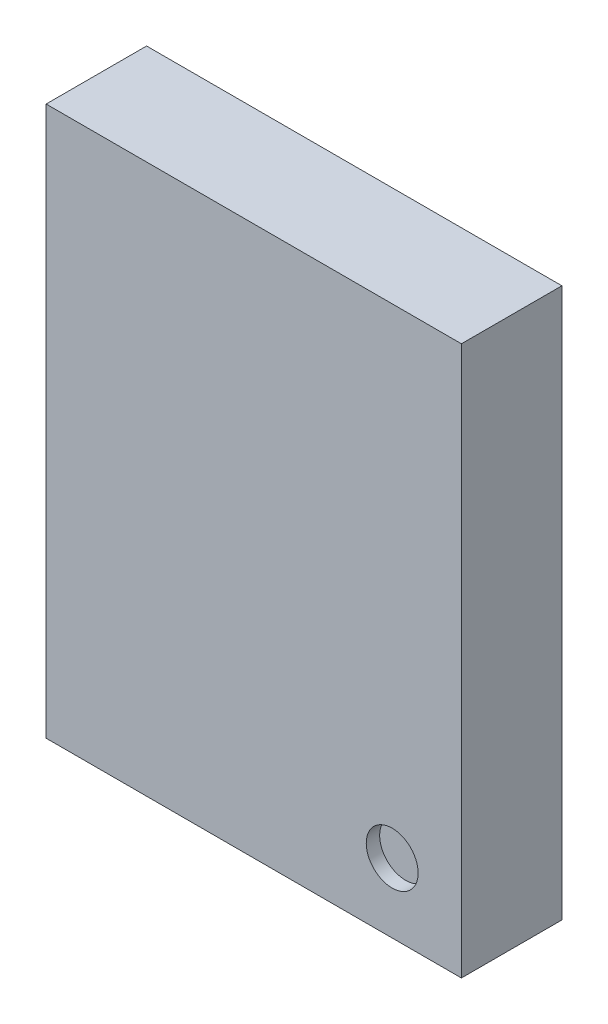
ISO-10303-21;
HEADER;
FILE_DESCRIPTION(('STEP AP214'),'2;1');
FILE_NAME('part.step','',(''),(''),'','','');
FILE_SCHEMA(('AUTOMOTIVE_DESIGN { 1 0 10303 214 1 1 1 1 }'));
ENDSEC;
DATA;
#1=APPLICATION_CONTEXT('core data for automotive mechanical design processes');
#2=APPLICATION_PROTOCOL_DEFINITION('international standard','automotive_design',2000,#1);
#3=PRODUCT_CONTEXT('',#1,'mechanical');
#4=PRODUCT('Part','Part','',(#3));
#5=PRODUCT_RELATED_PRODUCT_CATEGORY('part','',(#4));
#6=PRODUCT_DEFINITION_FORMATION('','',#4);
#7=PRODUCT_DEFINITION_CONTEXT('part definition',#1,'design');
#8=PRODUCT_DEFINITION('design','',#6,#7);
#9=PRODUCT_DEFINITION_SHAPE('','',#8);
#10=(LENGTH_UNIT() NAMED_UNIT(*) SI_UNIT(.MILLI.,.METRE.));
#11=(NAMED_UNIT(*) PLANE_ANGLE_UNIT() SI_UNIT($,.RADIAN.));
#12=(NAMED_UNIT(*) SI_UNIT($,.STERADIAN.) SOLID_ANGLE_UNIT());
#13=UNCERTAINTY_MEASURE_WITH_UNIT(LENGTH_MEASURE(1.E-05),#10,'distance_accuracy_value','');
#14=(GEOMETRIC_REPRESENTATION_CONTEXT(3) GLOBAL_UNCERTAINTY_ASSIGNED_CONTEXT((#13)) GLOBAL_UNIT_ASSIGNED_CONTEXT((#10,
#11,#12)) REPRESENTATION_CONTEXT('',''));
#15=CARTESIAN_POINT('',(0.,0.,0.));
#16=DIRECTION('',(0.,0.,1.));
#17=DIRECTION('',(1.,0.,0.));
#18=AXIS2_PLACEMENT_3D('',#15,#16,#17);
#19=CARTESIAN_POINT('',(44.211633119803,23.873785966457,0.75));
#20=DIRECTION('',(0.,0.,1.));
#21=DIRECTION('',(1.,0.,0.));
#22=AXIS2_PLACEMENT_3D('',#19,#20,#21);
#23=PLANE('',#22);
#24=CARTESIAN_POINT('',(44.211633119803,23.873785966457,0.75));
#25=DIRECTION('',(0.,0.,1.));
#26=DIRECTION('',(-1.,-8.74227765734797E-08,0.));
#27=AXIS2_PLACEMENT_3D('',#24,#25,#26);
#28=CIRCLE('',#27,0.19375);
#29=CARTESIAN_POINT('',(44.017883119803,23.873785949519,0.75));
#30=VERTEX_POINT('',#29);
#31=EDGE_CURVE('E26',#30,#30,#28,.T.);
#32=ORIENTED_EDGE('',*,*,#31,.T.);
#33=EDGE_LOOP('',(#32));
#34=FACE_BOUND('',#33,.T.);
#35=ADVANCED_FACE('F16',(#34),#23,.T.);
#36=CARTESIAN_POINT('',(44.211633119803,23.873785966457,0.75));
#37=DIRECTION('',(0.,0.,1.));
#38=DIRECTION('',(-1.,-8.74227765734797E-08,0.));
#39=AXIS2_PLACEMENT_3D('',#36,#37,#38);
#40=CYLINDRICAL_SURFACE('',#39,0.19375);
#41=ORIENTED_EDGE('',*,*,#31,.F.);
#42=DIRECTION('',(0.,0.,1.));
#43=VECTOR('',#42,1.);
#44=CARTESIAN_POINT('',(44.017883119803,23.873785949519,0.75));
#45=LINE('',#44,#43);
#46=CARTESIAN_POINT('',(44.017883119803,23.873785949519,0.85));
#47=VERTEX_POINT('',#46);
#48=EDGE_CURVE('E11',#30,#47,#45,.T.);
#49=ORIENTED_EDGE('',*,*,#48,.T.);
#50=CARTESIAN_POINT('',(44.211633119803,23.873785966457,0.85));
#51=DIRECTION('',(0.,0.,1.));
#52=DIRECTION('',(-1.,-8.74227765734797E-08,0.));
#53=AXIS2_PLACEMENT_3D('',#50,#51,#52);
#54=CIRCLE('',#53,0.19375);
#55=EDGE_CURVE('E83',#47,#47,#54,.T.);
#56=ORIENTED_EDGE('',*,*,#55,.T.);
#57=ORIENTED_EDGE('',*,*,#48,.F.);
#58=EDGE_LOOP('',(#41,#49,#56,#57));
#59=FACE_BOUND('',#58,.T.);
#60=ADVANCED_FACE('F159',(#59),#40,.F.);
#61=CARTESIAN_POINT('',(41.628299473205,27.457119073948,0.1));
#62=DIRECTION('',(-1.,-8.74227765734797E-08,0.));
#63=DIRECTION('',(-8.74227765734797E-08,1.,0.));
#64=AXIS2_PLACEMENT_3D('',#61,#62,#63);
#65=PLANE('',#64);
#66=DIRECTION('',(0.,0.,1.));
#67=VECTOR('',#66,1.);
#68=CARTESIAN_POINT('',(41.628299473205,27.457119073948,0.1));
#69=LINE('',#68,#67);
#70=CARTESIAN_POINT('',(41.628299473205,27.457119073948,0.1));
#71=VERTEX_POINT('',#70);
#72=CARTESIAN_POINT('',(41.628299473205,27.457119073948,0.85));
#73=VERTEX_POINT('',#72);
#74=EDGE_CURVE('E115',#71,#73,#69,.T.);
#75=ORIENTED_EDGE('',*,*,#74,.F.);
#76=DIRECTION('',(8.74227765734797E-08,-1.,0.));
#77=VECTOR('',#76,1.);
#78=CARTESIAN_POINT('',(41.628299473205,27.457119073948,0.1));
#79=LINE('',#78,#77);
#80=CARTESIAN_POINT('',(41.628299831639,23.357119073948,0.1));
#81=VERTEX_POINT('',#80);
#82=EDGE_CURVE('E112',#71,#81,#79,.T.);
#83=ORIENTED_EDGE('',*,*,#82,.T.);
#84=DIRECTION('',(0.,0.,1.));
#85=VECTOR('',#84,1.);
#86=CARTESIAN_POINT('',(41.628299831639,23.357119073948,0.1));
#87=LINE('',#86,#85);
#88=CARTESIAN_POINT('',(41.628299831639,23.357119073948,0.85));
#89=VERTEX_POINT('',#88);
#90=EDGE_CURVE('E79',#81,#89,#87,.T.);
#91=ORIENTED_EDGE('',*,*,#90,.T.);
#92=DIRECTION('',(8.74227765734797E-08,-1.,0.));
#93=VECTOR('',#92,1.);
#94=CARTESIAN_POINT('',(41.628299473205,27.457119073948,0.85));
#95=LINE('',#94,#93);
#96=EDGE_CURVE('E109',#73,#89,#95,.T.);
#97=ORIENTED_EDGE('',*,*,#96,.F.);
#98=EDGE_LOOP('',(#75,#83,#91,#97));
#99=FACE_BOUND('',#98,.T.);
#100=ADVANCED_FACE('F147',(#99),#65,.T.);
#101=CARTESIAN_POINT('',(44.728299473205,27.457119344958,0.1));
#102=DIRECTION('',(0.,0.,1.));
#103=DIRECTION('',(1.,0.,0.));
#104=AXIS2_PLACEMENT_3D('',#101,#102,#103);
#105=PLANE('',#104);
#106=DIRECTION('',(-1.,-8.74227765734797E-08,0.));
#107=VECTOR('',#106,1.);
#108=CARTESIAN_POINT('',(44.728299831639,23.357119344958,0.1));
#109=LINE('',#108,#107);
#110=CARTESIAN_POINT('',(44.728299831639,23.357119344958,0.1));
#111=VERTEX_POINT('',#110);
#112=EDGE_CURVE('E19',#111,#81,#109,.T.);
#113=ORIENTED_EDGE('',*,*,#112,.T.);
#114=ORIENTED_EDGE('',*,*,#82,.F.);
#115=DIRECTION('',(-1.,-8.74227765734797E-08,0.));
#116=VECTOR('',#115,1.);
#117=CARTESIAN_POINT('',(44.728299473205,27.457119344958,0.1));
#118=LINE('',#117,#116);
#119=CARTESIAN_POINT('',(44.728299473205,27.457119344958,0.1));
#120=VERTEX_POINT('',#119);
#121=EDGE_CURVE('E88',#120,#71,#118,.T.);
#122=ORIENTED_EDGE('',*,*,#121,.F.);
#123=DIRECTION('',(8.74227765734797E-08,-1.,0.));
#124=VECTOR('',#123,1.);
#125=CARTESIAN_POINT('',(44.728299473205,27.457119344958,0.1));
#126=LINE('',#125,#124);
#127=EDGE_CURVE('E85',#120,#111,#126,.T.);
#128=ORIENTED_EDGE('',*,*,#127,.T.);
#129=EDGE_LOOP('',(#113,#114,#122,#128));
#130=FACE_BOUND('',#129,.T.);
#131=ADVANCED_FACE('F86',(#130),#105,.F.);
#132=CARTESIAN_POINT('',(44.728299831639,23.357119344958,0.1));
#133=DIRECTION('',(8.74227765734797E-08,-1.,0.));
#134=DIRECTION('',(0.,0.,-1.));
#135=AXIS2_PLACEMENT_3D('',#132,#133,#134);
#136=PLANE('',#135);
#137=ORIENTED_EDGE('',*,*,#112,.F.);
#138=DIRECTION('',(0.,0.,1.));
#139=VECTOR('',#138,1.);
#140=CARTESIAN_POINT('',(44.728299831639,23.357119344958,0.1));
#141=LINE('',#140,#139);
#142=CARTESIAN_POINT('',(44.728299831639,23.357119344958,0.85));
#143=VERTEX_POINT('',#142);
#144=EDGE_CURVE('E76',#111,#143,#141,.T.);
#145=ORIENTED_EDGE('',*,*,#144,.T.);
#146=DIRECTION('',(-1.,-8.74227765734797E-08,0.));
#147=VECTOR('',#146,1.);
#148=CARTESIAN_POINT('',(44.728299831639,23.357119344958,0.85));
#149=LINE('',#148,#147);
#150=EDGE_CURVE('E131',#143,#89,#149,.T.);
#151=ORIENTED_EDGE('',*,*,#150,.T.);
#152=ORIENTED_EDGE('',*,*,#90,.F.);
#153=EDGE_LOOP('',(#137,#145,#151,#152));
#154=FACE_BOUND('',#153,.T.);
#155=ADVANCED_FACE('F73',(#154),#136,.T.);
#156=CARTESIAN_POINT('',(44.728299473205,27.457119344958,0.85));
#157=DIRECTION('',(0.,0.,1.));
#158=DIRECTION('',(1.,0.,0.));
#159=AXIS2_PLACEMENT_3D('',#156,#157,#158);
#160=PLANE('',#159);
#161=ORIENTED_EDGE('',*,*,#55,.F.);
#162=EDGE_LOOP('',(#161));
#163=FACE_BOUND('',#162,.T.);
#164=DIRECTION('',(8.74227765734797E-08,-1.,0.));
#165=VECTOR('',#164,1.);
#166=CARTESIAN_POINT('',(44.728299473205,27.457119344958,0.85));
#167=LINE('',#166,#165);
#168=CARTESIAN_POINT('',(44.728299473205,27.457119344958,0.85));
#169=VERTEX_POINT('',#168);
#170=EDGE_CURVE('E97',#169,#143,#167,.T.);
#171=ORIENTED_EDGE('',*,*,#170,.F.);
#172=DIRECTION('',(-1.,-8.74227765734797E-08,0.));
#173=VECTOR('',#172,1.);
#174=CARTESIAN_POINT('',(44.728299473205,27.457119344958,0.85));
#175=LINE('',#174,#173);
#176=EDGE_CURVE('E110',#169,#73,#175,.T.);
#177=ORIENTED_EDGE('',*,*,#176,.T.);
#178=ORIENTED_EDGE('',*,*,#96,.T.);
#179=ORIENTED_EDGE('',*,*,#150,.F.);
#180=EDGE_LOOP('',(#171,#177,#178,#179));
#181=FACE_BOUND('',#180,.T.);
#182=ADVANCED_FACE('F149',(#163,#181),#160,.T.);
#183=CARTESIAN_POINT('',(44.728299473205,27.457119344958,0.1));
#184=DIRECTION('',(8.74227765734797E-08,-1.,0.));
#185=DIRECTION('',(0.,0.,-1.));
#186=AXIS2_PLACEMENT_3D('',#183,#184,#185);
#187=PLANE('',#186);
#188=ORIENTED_EDGE('',*,*,#74,.T.);
#189=ORIENTED_EDGE('',*,*,#176,.F.);
#190=DIRECTION('',(0.,0.,1.));
#191=VECTOR('',#190,1.);
#192=CARTESIAN_POINT('',(44.728299473205,27.457119344958,0.1));
#193=LINE('',#192,#191);
#194=EDGE_CURVE('E93',#120,#169,#193,.T.);
#195=ORIENTED_EDGE('',*,*,#194,.F.);
#196=ORIENTED_EDGE('',*,*,#121,.T.);
#197=EDGE_LOOP('',(#188,#189,#195,#196));
#198=FACE_BOUND('',#197,.T.);
#199=ADVANCED_FACE('F148',(#198),#187,.F.);
#200=CARTESIAN_POINT('',(44.728299473205,27.457119344958,0.1));
#201=DIRECTION('',(-1.,-8.74227765734797E-08,0.));
#202=DIRECTION('',(-8.74227765734797E-08,1.,0.));
#203=AXIS2_PLACEMENT_3D('',#200,#201,#202);
#204=PLANE('',#203);
#205=ORIENTED_EDGE('',*,*,#170,.T.);
#206=ORIENTED_EDGE('',*,*,#144,.F.);
#207=ORIENTED_EDGE('',*,*,#127,.F.);
#208=ORIENTED_EDGE('',*,*,#194,.T.);
#209=EDGE_LOOP('',(#205,#206,#207,#208));
#210=FACE_BOUND('',#209,.T.);
#211=ADVANCED_FACE('F95',(#210),#204,.F.);
#212=CLOSED_SHELL('',(#35,#60,#100,#131,#155,#182,#199,#211));
#213=MANIFOLD_SOLID_BREP('B1',#212);
#214=ADVANCED_BREP_SHAPE_REPRESENTATION('',(#18,#213),#14);
#215=SHAPE_DEFINITION_REPRESENTATION(#9,#214);
ENDSEC;
END-ISO-10303-21;
